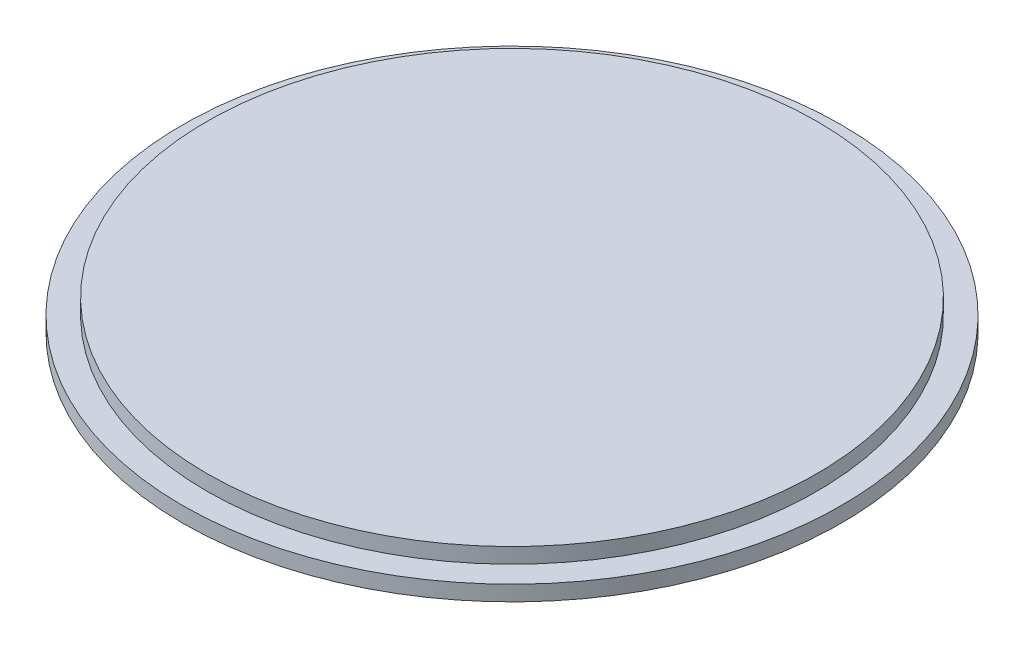
ISO-10303-21;
HEADER;
FILE_DESCRIPTION(('STEP AP214'),'2;1');
FILE_NAME('part.step','',(''),(''),'','','');
FILE_SCHEMA(('AUTOMOTIVE_DESIGN { 1 0 10303 214 1 1 1 1 }'));
ENDSEC;
DATA;
#1=APPLICATION_CONTEXT('core data for automotive mechanical design processes');
#2=APPLICATION_PROTOCOL_DEFINITION('international standard','automotive_design',2000,#1);
#3=PRODUCT_CONTEXT('',#1,'mechanical');
#4=PRODUCT('Part','Part','',(#3));
#5=PRODUCT_RELATED_PRODUCT_CATEGORY('part','',(#4));
#6=PRODUCT_DEFINITION_FORMATION('','',#4);
#7=PRODUCT_DEFINITION_CONTEXT('part definition',#1,'design');
#8=PRODUCT_DEFINITION('design','',#6,#7);
#9=PRODUCT_DEFINITION_SHAPE('','',#8);
#10=(LENGTH_UNIT() NAMED_UNIT(*) SI_UNIT(.MILLI.,.METRE.));
#11=(NAMED_UNIT(*) PLANE_ANGLE_UNIT() SI_UNIT($,.RADIAN.));
#12=(NAMED_UNIT(*) SI_UNIT($,.STERADIAN.) SOLID_ANGLE_UNIT());
#13=UNCERTAINTY_MEASURE_WITH_UNIT(LENGTH_MEASURE(1.E-05),#10,'distance_accuracy_value','');
#14=(GEOMETRIC_REPRESENTATION_CONTEXT(3) GLOBAL_UNCERTAINTY_ASSIGNED_CONTEXT((#13)) GLOBAL_UNIT_ASSIGNED_CONTEXT((#10,
#11,#12)) REPRESENTATION_CONTEXT('',''));
#15=CARTESIAN_POINT('',(0.,0.,0.));
#16=DIRECTION('',(0.,0.,1.));
#17=DIRECTION('',(1.,0.,0.));
#18=AXIS2_PLACEMENT_3D('',#15,#16,#17);
#19=CARTESIAN_POINT('',(0.,3.175,0.));
#20=DIRECTION('',(0.,-1.,0.));
#21=DIRECTION('',(0.,0.,-1.));
#22=AXIS2_PLACEMENT_3D('',#19,#20,#21);
#23=CYLINDRICAL_SURFACE('',#22,68.326);
#24=CARTESIAN_POINT('',(0.,3.175,0.));
#25=DIRECTION('',(0.,1.,0.));
#26=DIRECTION('',(0.,0.,1.));
#27=AXIS2_PLACEMENT_3D('',#24,#25,#26);
#28=CIRCLE('',#27,68.326);
#29=CARTESIAN_POINT('',(0.,3.175,68.326));
#30=VERTEX_POINT('',#29);
#31=EDGE_CURVE('E49',#30,#30,#28,.T.);
#32=ORIENTED_EDGE('',*,*,#31,.F.);
#33=EDGE_LOOP('',(#32));
#34=FACE_BOUND('',#33,.T.);
#35=CARTESIAN_POINT('',(0.,0.,0.));
#36=DIRECTION('',(0.,1.,0.));
#37=DIRECTION('',(0.,0.,1.));
#38=AXIS2_PLACEMENT_3D('',#35,#36,#37);
#39=CIRCLE('',#38,68.326);
#40=CARTESIAN_POINT('',(0.,0.,68.326));
#41=VERTEX_POINT('',#40);
#42=EDGE_CURVE('E44',#41,#41,#39,.T.);
#43=ORIENTED_EDGE('',*,*,#42,.T.);
#44=EDGE_LOOP('',(#43));
#45=FACE_BOUND('',#44,.T.);
#46=ADVANCED_FACE('F41',(#34,#45),#23,.T.);
#47=CARTESIAN_POINT('',(0.,3.175,0.));
#48=DIRECTION('',(0.,1.,0.));
#49=DIRECTION('',(0.,0.,1.));
#50=AXIS2_PLACEMENT_3D('',#47,#48,#49);
#51=PLANE('',#50);
#52=CARTESIAN_POINT('',(0.,3.175,0.));
#53=DIRECTION('',(0.,1.,0.));
#54=DIRECTION('',(0.,0.,1.));
#55=AXIS2_PLACEMENT_3D('',#52,#53,#54);
#56=CIRCLE('',#55,63.246);
#57=CARTESIAN_POINT('',(0.,3.175,63.246));
#58=VERTEX_POINT('',#57);
#59=EDGE_CURVE('E10',#58,#58,#56,.T.);
#60=ORIENTED_EDGE('',*,*,#59,.F.);
#61=EDGE_LOOP('',(#60));
#62=FACE_BOUND('',#61,.T.);
#63=ORIENTED_EDGE('',*,*,#31,.T.);
#64=EDGE_LOOP('',(#63));
#65=FACE_BOUND('',#64,.T.);
#66=ADVANCED_FACE('F69',(#62,#65),#51,.T.);
#67=CARTESIAN_POINT('',(0.,0.,0.));
#68=DIRECTION('',(0.,1.,0.));
#69=DIRECTION('',(0.,0.,1.));
#70=AXIS2_PLACEMENT_3D('',#67,#68,#69);
#71=PLANE('',#70);
#72=ORIENTED_EDGE('',*,*,#42,.F.);
#73=EDGE_LOOP('',(#72));
#74=FACE_BOUND('',#73,.T.);
#75=ADVANCED_FACE('F66',(#74),#71,.F.);
#76=CARTESIAN_POINT('',(0.,6.35,0.));
#77=DIRECTION('',(0.,-1.,0.));
#78=DIRECTION('',(0.,0.,-1.));
#79=AXIS2_PLACEMENT_3D('',#76,#77,#78);
#80=CYLINDRICAL_SURFACE('',#79,63.246);
#81=CARTESIAN_POINT('',(0.,6.35,0.));
#82=DIRECTION('',(0.,1.,0.));
#83=DIRECTION('',(0.,0.,1.));
#84=AXIS2_PLACEMENT_3D('',#81,#82,#83);
#85=CIRCLE('',#84,63.246);
#86=CARTESIAN_POINT('',(0.,6.35,63.246));
#87=VERTEX_POINT('',#86);
#88=EDGE_CURVE('E56',#87,#87,#85,.T.);
#89=ORIENTED_EDGE('',*,*,#88,.F.);
#90=EDGE_LOOP('',(#89));
#91=FACE_BOUND('',#90,.T.);
#92=ORIENTED_EDGE('',*,*,#59,.T.);
#93=EDGE_LOOP('',(#92));
#94=FACE_BOUND('',#93,.T.);
#95=ADVANCED_FACE('F68',(#91,#94),#80,.T.);
#96=CARTESIAN_POINT('',(0.,6.35,0.));
#97=DIRECTION('',(0.,1.,0.));
#98=DIRECTION('',(0.,0.,1.));
#99=AXIS2_PLACEMENT_3D('',#96,#97,#98);
#100=PLANE('',#99);
#101=ORIENTED_EDGE('',*,*,#88,.T.);
#102=EDGE_LOOP('',(#101));
#103=FACE_BOUND('',#102,.T.);
#104=ADVANCED_FACE('F74',(#103),#100,.T.);
#105=CLOSED_SHELL('',(#46,#66,#75,#95,#104));
#106=MANIFOLD_SOLID_BREP('B2',#105);
#107=ADVANCED_BREP_SHAPE_REPRESENTATION('',(#18,#106),#14);
#108=SHAPE_DEFINITION_REPRESENTATION(#9,#107);
ENDSEC;
END-ISO-10303-21;
